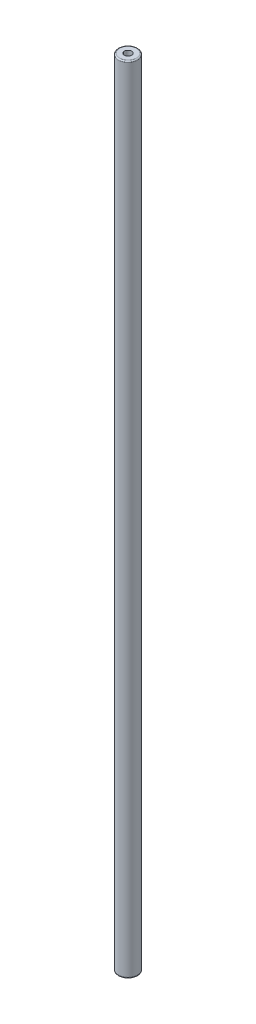
ISO-10303-21;
HEADER;
FILE_DESCRIPTION(('STEP AP214'),'2;1');
FILE_NAME('part.step','',(''),(''),'','','');
FILE_SCHEMA(('AUTOMOTIVE_DESIGN { 1 0 10303 214 1 1 1 1 }'));
ENDSEC;
DATA;
#1=APPLICATION_CONTEXT('core data for automotive mechanical design processes');
#2=APPLICATION_PROTOCOL_DEFINITION('international standard','automotive_design',2000,#1);
#3=PRODUCT_CONTEXT('',#1,'mechanical');
#4=PRODUCT('Part','Part','',(#3));
#5=PRODUCT_RELATED_PRODUCT_CATEGORY('part','',(#4));
#6=PRODUCT_DEFINITION_FORMATION('','',#4);
#7=PRODUCT_DEFINITION_CONTEXT('part definition',#1,'design');
#8=PRODUCT_DEFINITION('design','',#6,#7);
#9=PRODUCT_DEFINITION_SHAPE('','',#8);
#10=(LENGTH_UNIT() NAMED_UNIT(*) SI_UNIT(.MILLI.,.METRE.));
#11=(NAMED_UNIT(*) PLANE_ANGLE_UNIT() SI_UNIT($,.RADIAN.));
#12=(NAMED_UNIT(*) SI_UNIT($,.STERADIAN.) SOLID_ANGLE_UNIT());
#13=UNCERTAINTY_MEASURE_WITH_UNIT(LENGTH_MEASURE(1.E-05),#10,'distance_accuracy_value','');
#14=(GEOMETRIC_REPRESENTATION_CONTEXT(3) GLOBAL_UNCERTAINTY_ASSIGNED_CONTEXT((#13)) GLOBAL_UNIT_ASSIGNED_CONTEXT((#10,
#11,#12)) REPRESENTATION_CONTEXT('',''));
#15=CARTESIAN_POINT('',(0.,0.,0.));
#16=DIRECTION('',(0.,0.,1.));
#17=DIRECTION('',(1.,0.,0.));
#18=AXIS2_PLACEMENT_3D('',#15,#16,#17);
#19=CARTESIAN_POINT('',(0.,-164.95,0.));
#20=DIRECTION('',(0.,1.,0.));
#21=DIRECTION('',(0.,0.,1.));
#22=AXIS2_PLACEMENT_3D('',#19,#20,#21);
#23=CYLINDRICAL_SURFACE('',#22,4.);
#24=CARTESIAN_POINT('',(0.,164.45,0.));
#25=DIRECTION('',(0.,1.,0.));
#26=DIRECTION('',(0.,0.,1.));
#27=AXIS2_PLACEMENT_3D('',#24,#25,#26);
#28=CIRCLE('',#27,4.);
#29=CARTESIAN_POINT('',(0.,164.45,4.));
#30=VERTEX_POINT('',#29);
#31=EDGE_CURVE('E40',#30,#30,#28,.F.);
#32=ORIENTED_EDGE('',*,*,#31,.T.);
#33=EDGE_LOOP('',(#32));
#34=FACE_BOUND('',#33,.T.);
#35=CARTESIAN_POINT('',(0.,-164.45,0.));
#36=DIRECTION('',(0.,1.,0.));
#37=DIRECTION('',(0.,0.,1.));
#38=AXIS2_PLACEMENT_3D('',#35,#36,#37);
#39=CIRCLE('',#38,4.);
#40=CARTESIAN_POINT('',(0.,-164.45,4.));
#41=VERTEX_POINT('',#40);
#42=EDGE_CURVE('E44',#41,#41,#39,.T.);
#43=ORIENTED_EDGE('',*,*,#42,.T.);
#44=EDGE_LOOP('',(#43));
#45=FACE_BOUND('',#44,.T.);
#46=ADVANCED_FACE('F33',(#34,#45),#23,.T.);
#47=CARTESIAN_POINT('',(0.,-164.95,0.));
#48=DIRECTION('',(0.,1.,0.));
#49=DIRECTION('',(0.,0.,1.));
#50=AXIS2_PLACEMENT_3D('',#47,#48,#49);
#51=PLANE('',#50);
#52=CARTESIAN_POINT('',(0.,-164.95,0.));
#53=DIRECTION('',(0.,1.,0.));
#54=DIRECTION('',(0.,0.,1.));
#55=AXIS2_PLACEMENT_3D('',#52,#53,#54);
#56=CIRCLE('',#55,3.5);
#57=CARTESIAN_POINT('',(0.,-164.95,3.5));
#58=VERTEX_POINT('',#57);
#59=EDGE_CURVE('E10',#58,#58,#56,.F.);
#60=ORIENTED_EDGE('',*,*,#59,.T.);
#61=EDGE_LOOP('',(#60));
#62=FACE_BOUND('',#61,.T.);
#63=CARTESIAN_POINT('',(0.,-164.95,0.));
#64=DIRECTION('',(0.,1.,0.));
#65=DIRECTION('',(0.,0.,1.));
#66=AXIS2_PLACEMENT_3D('',#63,#64,#65);
#67=CIRCLE('',#66,1.5);
#68=CARTESIAN_POINT('',(0.,-164.95,1.5));
#69=VERTEX_POINT('',#68);
#70=EDGE_CURVE('E60',#69,#69,#67,.T.);
#71=ORIENTED_EDGE('',*,*,#70,.T.);
#72=EDGE_LOOP('',(#71));
#73=FACE_BOUND('',#72,.T.);
#74=ADVANCED_FACE('F81',(#62,#73),#51,.F.);
#75=CARTESIAN_POINT('',(0.,164.95,0.));
#76=DIRECTION('',(0.,1.,0.));
#77=DIRECTION('',(0.,0.,1.));
#78=AXIS2_PLACEMENT_3D('',#75,#76,#77);
#79=PLANE('',#78);
#80=CARTESIAN_POINT('',(0.,164.95,0.));
#81=DIRECTION('',(0.,1.,0.));
#82=DIRECTION('',(0.,0.,1.));
#83=AXIS2_PLACEMENT_3D('',#80,#81,#82);
#84=CIRCLE('',#83,3.5);
#85=CARTESIAN_POINT('',(0.,164.95,3.5));
#86=VERTEX_POINT('',#85);
#87=EDGE_CURVE('E48',#86,#86,#84,.T.);
#88=ORIENTED_EDGE('',*,*,#87,.T.);
#89=EDGE_LOOP('',(#88));
#90=FACE_BOUND('',#89,.T.);
#91=CARTESIAN_POINT('',(0.,164.95,0.));
#92=DIRECTION('',(0.,1.,0.));
#93=DIRECTION('',(0.,0.,1.));
#94=AXIS2_PLACEMENT_3D('',#91,#92,#93);
#95=CIRCLE('',#94,1.5);
#96=CARTESIAN_POINT('',(0.,164.95,1.5));
#97=VERTEX_POINT('',#96);
#98=EDGE_CURVE('E54',#97,#97,#95,.T.);
#99=ORIENTED_EDGE('',*,*,#98,.F.);
#100=EDGE_LOOP('',(#99));
#101=FACE_BOUND('',#100,.T.);
#102=ADVANCED_FACE('F86',(#90,#101),#79,.T.);
#103=CARTESIAN_POINT('',(0.,159.95,0.));
#104=DIRECTION('',(0.,1.,0.));
#105=DIRECTION('',(0.,0.,1.));
#106=AXIS2_PLACEMENT_3D('',#103,#104,#105);
#107=CYLINDRICAL_SURFACE('',#106,1.5);
#108=CARTESIAN_POINT('',(0.,159.95,0.));
#109=DIRECTION('',(0.,1.,0.));
#110=DIRECTION('',(0.,0.,1.));
#111=AXIS2_PLACEMENT_3D('',#108,#109,#110);
#112=CIRCLE('',#111,1.5);
#113=CARTESIAN_POINT('',(0.,159.95,1.5));
#114=VERTEX_POINT('',#113);
#115=EDGE_CURVE('E53',#114,#114,#112,.T.);
#116=ORIENTED_EDGE('',*,*,#115,.F.);
#117=EDGE_LOOP('',(#116));
#118=FACE_BOUND('',#117,.T.);
#119=ORIENTED_EDGE('',*,*,#98,.T.);
#120=EDGE_LOOP('',(#119));
#121=FACE_BOUND('',#120,.T.);
#122=ADVANCED_FACE('F92',(#118,#121),#107,.F.);
#123=CARTESIAN_POINT('',(0.,159.95,0.));
#124=DIRECTION('',(0.,1.,0.));
#125=DIRECTION('',(0.,0.,1.));
#126=AXIS2_PLACEMENT_3D('',#123,#124,#125);
#127=PLANE('',#126);
#128=ORIENTED_EDGE('',*,*,#115,.T.);
#129=EDGE_LOOP('',(#128));
#130=FACE_BOUND('',#129,.T.);
#131=ADVANCED_FACE('F78',(#130),#127,.T.);
#132=CARTESIAN_POINT('',(0.,-159.95,0.));
#133=DIRECTION('',(0.,-1.,0.));
#134=DIRECTION('',(0.,0.,-1.));
#135=AXIS2_PLACEMENT_3D('',#132,#133,#134);
#136=CYLINDRICAL_SURFACE('',#135,1.5);
#137=CARTESIAN_POINT('',(0.,-159.95,0.));
#138=DIRECTION('',(0.,1.,0.));
#139=DIRECTION('',(0.,0.,1.));
#140=AXIS2_PLACEMENT_3D('',#137,#138,#139);
#141=CIRCLE('',#140,1.5);
#142=CARTESIAN_POINT('',(0.,-159.95,1.5));
#143=VERTEX_POINT('',#142);
#144=EDGE_CURVE('E57',#143,#143,#141,.T.);
#145=ORIENTED_EDGE('',*,*,#144,.T.);
#146=EDGE_LOOP('',(#145));
#147=FACE_BOUND('',#146,.T.);
#148=ORIENTED_EDGE('',*,*,#70,.F.);
#149=EDGE_LOOP('',(#148));
#150=FACE_BOUND('',#149,.T.);
#151=ADVANCED_FACE('F66',(#147,#150),#136,.F.);
#152=CARTESIAN_POINT('',(0.,-159.95,0.));
#153=DIRECTION('',(0.,-1.,0.));
#154=DIRECTION('',(0.,0.,1.));
#155=AXIS2_PLACEMENT_3D('',#152,#153,#154);
#156=PLANE('',#155);
#157=ORIENTED_EDGE('',*,*,#144,.F.);
#158=EDGE_LOOP('',(#157));
#159=FACE_BOUND('',#158,.T.);
#160=ADVANCED_FACE('F69',(#159),#156,.T.);
#161=CARTESIAN_POINT('',(0.,164.45,0.));
#162=DIRECTION('',(0.,1.,0.));
#163=DIRECTION('',(0.,0.,1.));
#164=AXIS2_PLACEMENT_3D('',#161,#162,#163);
#165=TOROIDAL_SURFACE('',#164,3.5,0.5);
#166=ORIENTED_EDGE('',*,*,#31,.F.);
#167=EDGE_LOOP('',(#166));
#168=FACE_BOUND('',#167,.T.);
#169=ORIENTED_EDGE('',*,*,#87,.F.);
#170=EDGE_LOOP('',(#169));
#171=FACE_BOUND('',#170,.T.);
#172=ADVANCED_FACE('F71',(#168,#171),#165,.T.);
#173=CARTESIAN_POINT('',(0.,-164.45,0.));
#174=DIRECTION('',(0.,1.,0.));
#175=DIRECTION('',(0.,0.,1.));
#176=AXIS2_PLACEMENT_3D('',#173,#174,#175);
#177=TOROIDAL_SURFACE('',#176,3.5,0.5);
#178=ORIENTED_EDGE('',*,*,#59,.F.);
#179=EDGE_LOOP('',(#178));
#180=FACE_BOUND('',#179,.T.);
#181=ORIENTED_EDGE('',*,*,#42,.F.);
#182=EDGE_LOOP('',(#181));
#183=FACE_BOUND('',#182,.T.);
#184=ADVANCED_FACE('F35',(#180,#183),#177,.T.);
#185=CLOSED_SHELL('',(#46,#74,#102,#122,#131,#151,#160,#172,#184));
#186=MANIFOLD_SOLID_BREP('B2',#185);
#187=ADVANCED_BREP_SHAPE_REPRESENTATION('',(#18,#186),#14);
#188=SHAPE_DEFINITION_REPRESENTATION(#9,#187);
ENDSEC;
END-ISO-10303-21;
